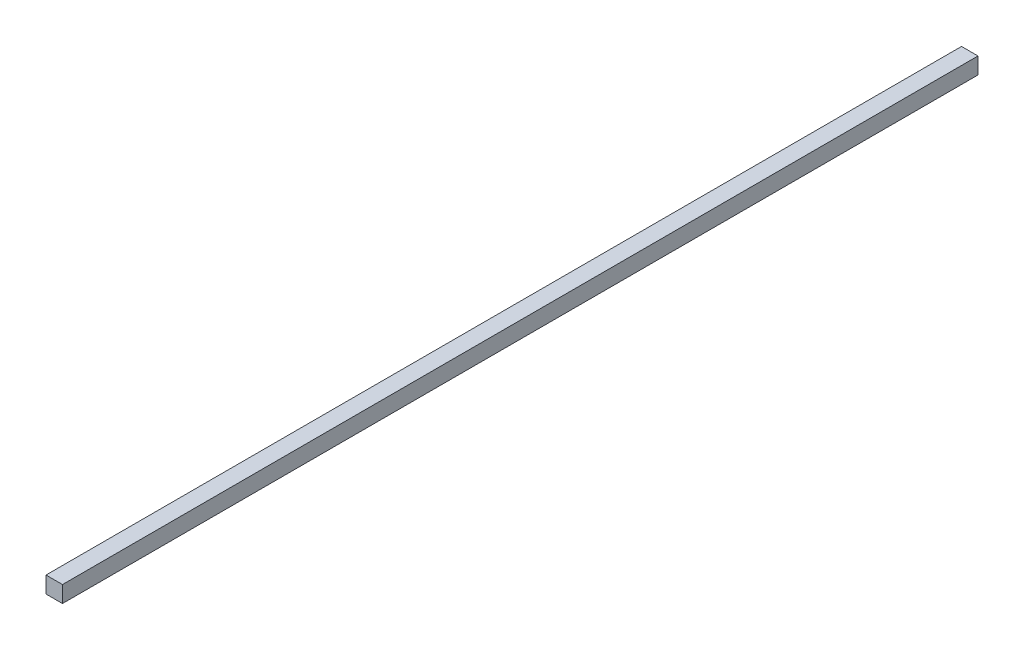
ISO-10303-21;
HEADER;
FILE_DESCRIPTION(('STEP AP214'),'2;1');
FILE_NAME('part.step','',(''),(''),'','','');
FILE_SCHEMA(('AUTOMOTIVE_DESIGN { 1 0 10303 214 1 1 1 1 }'));
ENDSEC;
DATA;
#1=APPLICATION_CONTEXT('core data for automotive mechanical design processes');
#2=APPLICATION_PROTOCOL_DEFINITION('international standard','automotive_design',2000,#1);
#3=PRODUCT_CONTEXT('',#1,'mechanical');
#4=PRODUCT('Part','Part','',(#3));
#5=PRODUCT_RELATED_PRODUCT_CATEGORY('part','',(#4));
#6=PRODUCT_DEFINITION_FORMATION('','',#4);
#7=PRODUCT_DEFINITION_CONTEXT('part definition',#1,'design');
#8=PRODUCT_DEFINITION('design','',#6,#7);
#9=PRODUCT_DEFINITION_SHAPE('','',#8);
#10=(LENGTH_UNIT() NAMED_UNIT(*) SI_UNIT(.MILLI.,.METRE.));
#11=(NAMED_UNIT(*) PLANE_ANGLE_UNIT() SI_UNIT($,.RADIAN.));
#12=(NAMED_UNIT(*) SI_UNIT($,.STERADIAN.) SOLID_ANGLE_UNIT());
#13=UNCERTAINTY_MEASURE_WITH_UNIT(LENGTH_MEASURE(1.E-05),#10,'distance_accuracy_value','');
#14=(GEOMETRIC_REPRESENTATION_CONTEXT(3) GLOBAL_UNCERTAINTY_ASSIGNED_CONTEXT((#13)) GLOBAL_UNIT_ASSIGNED_CONTEXT((#10,
#11,#12)) REPRESENTATION_CONTEXT('',''));
#15=CARTESIAN_POINT('',(0.,0.,0.));
#16=DIRECTION('',(0.,0.,1.));
#17=DIRECTION('',(1.,0.,0.));
#18=AXIS2_PLACEMENT_3D('',#15,#16,#17);
#19=CARTESIAN_POINT('',(0.,0.,1270.));
#20=DIRECTION('',(1.,0.,0.));
#21=DIRECTION('',(0.,0.,-1.));
#22=AXIS2_PLACEMENT_3D('',#19,#20,#21);
#23=PLANE('',#22);
#24=DIRECTION('',(0.,-1.,0.));
#25=VECTOR('',#24,1.);
#26=CARTESIAN_POINT('',(0.,0.,0.));
#27=LINE('',#26,#25);
#28=CARTESIAN_POINT('',(0.,22.86,0.));
#29=VERTEX_POINT('',#28);
#30=CARTESIAN_POINT('',(0.,0.,0.));
#31=VERTEX_POINT('',#30);
#32=EDGE_CURVE('E82',#29,#31,#27,.T.);
#33=ORIENTED_EDGE('',*,*,#32,.T.);
#34=DIRECTION('',(0.,0.,-1.));
#35=VECTOR('',#34,1.);
#36=CARTESIAN_POINT('',(0.,0.,1270.));
#37=LINE('',#36,#35);
#38=CARTESIAN_POINT('',(0.,0.,1270.));
#39=VERTEX_POINT('',#38);
#40=EDGE_CURVE('E11',#39,#31,#37,.T.);
#41=ORIENTED_EDGE('',*,*,#40,.F.);
#42=DIRECTION('',(0.,-1.,0.));
#43=VECTOR('',#42,1.);
#44=CARTESIAN_POINT('',(0.,0.,1270.));
#45=LINE('',#44,#43);
#46=CARTESIAN_POINT('',(0.,22.86,1270.));
#47=VERTEX_POINT('',#46);
#48=EDGE_CURVE('E100',#47,#39,#45,.T.);
#49=ORIENTED_EDGE('',*,*,#48,.F.);
#50=DIRECTION('',(0.,0.,-1.));
#51=VECTOR('',#50,1.);
#52=CARTESIAN_POINT('',(0.,22.86,1270.));
#53=LINE('',#52,#51);
#54=EDGE_CURVE('E94',#47,#29,#53,.T.);
#55=ORIENTED_EDGE('',*,*,#54,.T.);
#56=EDGE_LOOP('',(#33,#41,#49,#55));
#57=FACE_BOUND('',#56,.T.);
#58=ADVANCED_FACE('F38',(#57),#23,.F.);
#59=CARTESIAN_POINT('',(0.,0.,1270.));
#60=DIRECTION('',(0.,1.,0.));
#61=DIRECTION('',(0.,0.,1.));
#62=AXIS2_PLACEMENT_3D('',#59,#60,#61);
#63=PLANE('',#62);
#64=DIRECTION('',(1.,0.,0.));
#65=VECTOR('',#64,1.);
#66=CARTESIAN_POINT('',(0.,0.,0.));
#67=LINE('',#66,#65);
#68=CARTESIAN_POINT('',(22.86,0.,0.));
#69=VERTEX_POINT('',#68);
#70=EDGE_CURVE('E78',#31,#69,#67,.T.);
#71=ORIENTED_EDGE('',*,*,#70,.T.);
#72=DIRECTION('',(0.,0.,-1.));
#73=VECTOR('',#72,1.);
#74=CARTESIAN_POINT('',(22.86,0.,1270.));
#75=LINE('',#74,#73);
#76=CARTESIAN_POINT('',(22.86,0.,1270.));
#77=VERTEX_POINT('',#76);
#78=EDGE_CURVE('E45',#77,#69,#75,.T.);
#79=ORIENTED_EDGE('',*,*,#78,.F.);
#80=DIRECTION('',(1.,0.,0.));
#81=VECTOR('',#80,1.);
#82=CARTESIAN_POINT('',(0.,0.,1270.));
#83=LINE('',#82,#81);
#84=EDGE_CURVE('E90',#39,#77,#83,.T.);
#85=ORIENTED_EDGE('',*,*,#84,.F.);
#86=ORIENTED_EDGE('',*,*,#40,.T.);
#87=EDGE_LOOP('',(#71,#79,#85,#86));
#88=FACE_BOUND('',#87,.T.);
#89=ADVANCED_FACE('F89',(#88),#63,.F.);
#90=CARTESIAN_POINT('',(22.86,0.,1270.));
#91=DIRECTION('',(-1.,0.,0.));
#92=DIRECTION('',(0.,0.,1.));
#93=AXIS2_PLACEMENT_3D('',#90,#91,#92);
#94=PLANE('',#93);
#95=DIRECTION('',(0.,1.,0.));
#96=VECTOR('',#95,1.);
#97=CARTESIAN_POINT('',(22.86,0.,0.));
#98=LINE('',#97,#96);
#99=CARTESIAN_POINT('',(22.86,22.86,0.));
#100=VERTEX_POINT('',#99);
#101=EDGE_CURVE('E83',#69,#100,#98,.T.);
#102=ORIENTED_EDGE('',*,*,#101,.T.);
#103=DIRECTION('',(0.,0.,-1.));
#104=VECTOR('',#103,1.);
#105=CARTESIAN_POINT('',(22.86,22.86,1270.));
#106=LINE('',#105,#104);
#107=CARTESIAN_POINT('',(22.86,22.86,1270.));
#108=VERTEX_POINT('',#107);
#109=EDGE_CURVE('E106',#108,#100,#106,.T.);
#110=ORIENTED_EDGE('',*,*,#109,.F.);
#111=DIRECTION('',(0.,1.,0.));
#112=VECTOR('',#111,1.);
#113=CARTESIAN_POINT('',(22.86,0.,1270.));
#114=LINE('',#113,#112);
#115=EDGE_CURVE('E57',#77,#108,#114,.T.);
#116=ORIENTED_EDGE('',*,*,#115,.F.);
#117=ORIENTED_EDGE('',*,*,#78,.T.);
#118=EDGE_LOOP('',(#102,#110,#116,#117));
#119=FACE_BOUND('',#118,.T.);
#120=ADVANCED_FACE('F109',(#119),#94,.F.);
#121=CARTESIAN_POINT('',(0.,22.86,1270.));
#122=DIRECTION('',(0.,-1.,0.));
#123=DIRECTION('',(0.,0.,-1.));
#124=AXIS2_PLACEMENT_3D('',#121,#122,#123);
#125=PLANE('',#124);
#126=DIRECTION('',(-1.,0.,0.));
#127=VECTOR('',#126,1.);
#128=CARTESIAN_POINT('',(0.,22.86,0.));
#129=LINE('',#128,#127);
#130=EDGE_CURVE('E98',#100,#29,#129,.T.);
#131=ORIENTED_EDGE('',*,*,#130,.T.);
#132=ORIENTED_EDGE('',*,*,#54,.F.);
#133=DIRECTION('',(-1.,0.,0.));
#134=VECTOR('',#133,1.);
#135=CARTESIAN_POINT('',(0.,22.86,1270.));
#136=LINE('',#135,#134);
#137=EDGE_CURVE('E52',#108,#47,#136,.T.);
#138=ORIENTED_EDGE('',*,*,#137,.F.);
#139=ORIENTED_EDGE('',*,*,#109,.T.);
#140=EDGE_LOOP('',(#131,#132,#138,#139));
#141=FACE_BOUND('',#140,.T.);
#142=ADVANCED_FACE('F111',(#141),#125,.F.);
#143=CARTESIAN_POINT('',(0.,22.86,1270.));
#144=DIRECTION('',(0.,0.,-1.));
#145=DIRECTION('',(-1.,0.,0.));
#146=AXIS2_PLACEMENT_3D('',#143,#144,#145);
#147=PLANE('',#146);
#148=ORIENTED_EDGE('',*,*,#48,.T.);
#149=ORIENTED_EDGE('',*,*,#84,.T.);
#150=ORIENTED_EDGE('',*,*,#115,.T.);
#151=ORIENTED_EDGE('',*,*,#137,.T.);
#152=EDGE_LOOP('',(#148,#149,#150,#151));
#153=FACE_BOUND('',#152,.T.);
#154=ADVANCED_FACE('F112',(#153),#147,.F.);
#155=CARTESIAN_POINT('',(0.,22.86,0.));
#156=DIRECTION('',(0.,0.,-1.));
#157=DIRECTION('',(-1.,0.,0.));
#158=AXIS2_PLACEMENT_3D('',#155,#156,#157);
#159=PLANE('',#158);
#160=ORIENTED_EDGE('',*,*,#32,.F.);
#161=ORIENTED_EDGE('',*,*,#130,.F.);
#162=ORIENTED_EDGE('',*,*,#101,.F.);
#163=ORIENTED_EDGE('',*,*,#70,.F.);
#164=EDGE_LOOP('',(#160,#161,#162,#163));
#165=FACE_BOUND('',#164,.T.);
#166=ADVANCED_FACE('F79',(#165),#159,.T.);
#167=CLOSED_SHELL('',(#58,#89,#120,#142,#154,#166));
#168=MANIFOLD_SOLID_BREP('B2',#167);
#169=ADVANCED_BREP_SHAPE_REPRESENTATION('',(#18,#168),#14);
#170=SHAPE_DEFINITION_REPRESENTATION(#9,#169);
ENDSEC;
END-ISO-10303-21;
